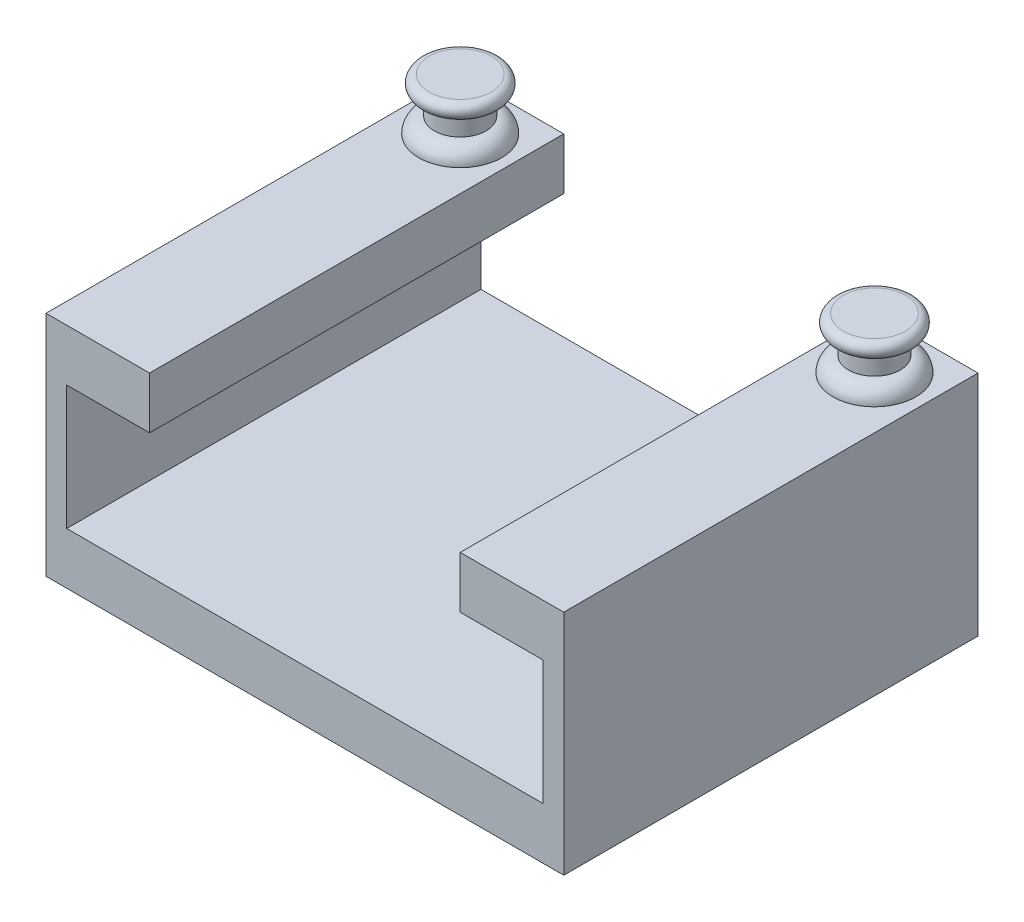
ISO-10303-21;
HEADER;
FILE_DESCRIPTION(('STEP AP214'),'2;1');
FILE_NAME('part.step','',(''),(''),'','','');
FILE_SCHEMA(('AUTOMOTIVE_DESIGN { 1 0 10303 214 1 1 1 1 }'));
ENDSEC;
DATA;
#1=APPLICATION_CONTEXT('core data for automotive mechanical design processes');
#2=APPLICATION_PROTOCOL_DEFINITION('international standard','automotive_design',2000,#1);
#3=PRODUCT_CONTEXT('',#1,'mechanical');
#4=PRODUCT('Part','Part','',(#3));
#5=PRODUCT_RELATED_PRODUCT_CATEGORY('part','',(#4));
#6=PRODUCT_DEFINITION_FORMATION('','',#4);
#7=PRODUCT_DEFINITION_CONTEXT('part definition',#1,'design');
#8=PRODUCT_DEFINITION('design','',#6,#7);
#9=PRODUCT_DEFINITION_SHAPE('','',#8);
#10=(LENGTH_UNIT() NAMED_UNIT(*) SI_UNIT(.MILLI.,.METRE.));
#11=(NAMED_UNIT(*) PLANE_ANGLE_UNIT() SI_UNIT($,.RADIAN.));
#12=(NAMED_UNIT(*) SI_UNIT($,.STERADIAN.) SOLID_ANGLE_UNIT());
#13=UNCERTAINTY_MEASURE_WITH_UNIT(LENGTH_MEASURE(1.E-05),#10,'distance_accuracy_value','');
#14=(GEOMETRIC_REPRESENTATION_CONTEXT(3) GLOBAL_UNCERTAINTY_ASSIGNED_CONTEXT((#13)) GLOBAL_UNIT_ASSIGNED_CONTEXT((#10,
#11,#12)) REPRESENTATION_CONTEXT('',''));
#15=CARTESIAN_POINT('',(0.,0.,0.));
#16=DIRECTION('',(0.,0.,1.));
#17=DIRECTION('',(1.,0.,0.));
#18=AXIS2_PLACEMENT_3D('',#15,#16,#17);
#19=CARTESIAN_POINT('',(0.,22.,0.));
#20=DIRECTION('',(0.,-1.,0.));
#21=DIRECTION('',(0.,0.,-1.));
#22=AXIS2_PLACEMENT_3D('',#19,#20,#21);
#23=PLANE('',#22);
#24=DIRECTION('',(0.,0.,-1.));
#25=VECTOR('',#24,1.);
#26=CARTESIAN_POINT('',(50.,22.,-40.));
#27=LINE('',#26,#25);
#28=CARTESIAN_POINT('',(50.,22.,0.));
#29=VERTEX_POINT('',#28);
#30=CARTESIAN_POINT('',(50.,22.,-40.));
#31=VERTEX_POINT('',#30);
#32=EDGE_CURVE('E127',#29,#31,#27,.T.);
#33=ORIENTED_EDGE('',*,*,#32,.T.);
#34=DIRECTION('',(-1.,0.,0.));
#35=VECTOR('',#34,1.);
#36=CARTESIAN_POINT('',(50.,22.,-40.));
#37=LINE('',#36,#35);
#38=CARTESIAN_POINT('',(40.,22.,-40.));
#39=VERTEX_POINT('',#38);
#40=EDGE_CURVE('E135',#31,#39,#37,.T.);
#41=ORIENTED_EDGE('',*,*,#40,.T.);
#42=DIRECTION('',(0.,0.,1.));
#43=VECTOR('',#42,1.);
#44=CARTESIAN_POINT('',(40.,22.,-40.));
#45=LINE('',#44,#43);
#46=CARTESIAN_POINT('',(40.,22.,0.));
#47=VERTEX_POINT('',#46);
#48=EDGE_CURVE('E141',#39,#47,#45,.T.);
#49=ORIENTED_EDGE('',*,*,#48,.T.);
#50=DIRECTION('',(1.,0.,0.));
#51=VECTOR('',#50,1.);
#52=CARTESIAN_POINT('',(50.,22.,0.));
#53=LINE('',#52,#51);
#54=EDGE_CURVE('E146',#47,#29,#53,.T.);
#55=ORIENTED_EDGE('',*,*,#54,.T.);
#56=EDGE_LOOP('',(#33,#41,#49,#55));
#57=FACE_BOUND('',#56,.T.);
#58=CARTESIAN_POINT('',(45.,22.,-35.));
#59=DIRECTION('',(0.,-1.,0.));
#60=DIRECTION('',(0.,0.,-1.));
#61=AXIS2_PLACEMENT_3D('',#58,#59,#60);
#62=CIRCLE('',#61,4.);
#63=CARTESIAN_POINT('',(45.,22.,-39.));
#64=VERTEX_POINT('',#63);
#65=EDGE_CURVE('E11',#64,#64,#62,.F.);
#66=ORIENTED_EDGE('',*,*,#65,.F.);
#67=EDGE_LOOP('',(#66));
#68=FACE_BOUND('',#67,.T.);
#69=ADVANCED_FACE('F35',(#57,#68),#23,.F.);
#70=CARTESIAN_POINT('',(0.,22.,0.));
#71=DIRECTION('',(0.,1.,0.));
#72=DIRECTION('',(0.,0.,1.));
#73=AXIS2_PLACEMENT_3D('',#70,#71,#72);
#74=PLANE('',#73);
#75=DIRECTION('',(0.,0.,1.));
#76=VECTOR('',#75,1.);
#77=CARTESIAN_POINT('',(0.,22.,-40.));
#78=LINE('',#77,#76);
#79=CARTESIAN_POINT('',(0.,22.,-40.));
#80=VERTEX_POINT('',#79);
#81=CARTESIAN_POINT('',(0.,22.,0.));
#82=VERTEX_POINT('',#81);
#83=EDGE_CURVE('E166',#80,#82,#78,.T.);
#84=ORIENTED_EDGE('',*,*,#83,.T.);
#85=DIRECTION('',(1.,0.,0.));
#86=VECTOR('',#85,1.);
#87=CARTESIAN_POINT('',(0.,22.,0.));
#88=LINE('',#87,#86);
#89=CARTESIAN_POINT('',(10.,22.,0.));
#90=VERTEX_POINT('',#89);
#91=EDGE_CURVE('E169',#82,#90,#88,.T.);
#92=ORIENTED_EDGE('',*,*,#91,.T.);
#93=DIRECTION('',(0.,0.,-1.));
#94=VECTOR('',#93,1.);
#95=CARTESIAN_POINT('',(10.,22.,-40.));
#96=LINE('',#95,#94);
#97=CARTESIAN_POINT('',(10.,22.,-40.));
#98=VERTEX_POINT('',#97);
#99=EDGE_CURVE('E172',#90,#98,#96,.T.);
#100=ORIENTED_EDGE('',*,*,#99,.T.);
#101=DIRECTION('',(-1.,0.,0.));
#102=VECTOR('',#101,1.);
#103=CARTESIAN_POINT('',(0.,22.,-40.));
#104=LINE('',#103,#102);
#105=EDGE_CURVE('E174',#98,#80,#104,.T.);
#106=ORIENTED_EDGE('',*,*,#105,.T.);
#107=EDGE_LOOP('',(#84,#92,#100,#106));
#108=FACE_BOUND('',#107,.T.);
#109=CARTESIAN_POINT('',(5.,22.,-35.));
#110=DIRECTION('',(0.,-1.,0.));
#111=DIRECTION('',(1.,0.,0.));
#112=AXIS2_PLACEMENT_3D('',#109,#110,#111);
#113=CIRCLE('',#112,4.);
#114=CARTESIAN_POINT('',(9.,22.,-35.));
#115=VERTEX_POINT('',#114);
#116=EDGE_CURVE('E523',#115,#115,#113,.T.);
#117=ORIENTED_EDGE('',*,*,#116,.T.);
#118=EDGE_LOOP('',(#117));
#119=FACE_BOUND('',#118,.T.);
#120=ADVANCED_FACE('F255',(#108,#119),#74,.T.);
#121=CARTESIAN_POINT('',(0.,5.,0.));
#122=DIRECTION('',(0.,1.,0.));
#123=DIRECTION('',(0.,0.,1.));
#124=AXIS2_PLACEMENT_3D('',#121,#122,#123);
#125=PLANE('',#124);
#126=DIRECTION('',(1.,0.,0.));
#127=VECTOR('',#126,1.);
#128=CARTESIAN_POINT('',(0.,5.,0.));
#129=LINE('',#128,#127);
#130=CARTESIAN_POINT('',(2.,5.,0.));
#131=VERTEX_POINT('',#130);
#132=CARTESIAN_POINT('',(48.,5.,0.));
#133=VERTEX_POINT('',#132);
#134=EDGE_CURVE('E55',#131,#133,#129,.T.);
#135=ORIENTED_EDGE('',*,*,#134,.T.);
#136=DIRECTION('',(0.,0.,1.));
#137=VECTOR('',#136,1.);
#138=CARTESIAN_POINT('',(48.,5.,-40.));
#139=LINE('',#138,#137);
#140=CARTESIAN_POINT('',(48.,5.,-40.));
#141=VERTEX_POINT('',#140);
#142=EDGE_CURVE('E50',#141,#133,#139,.T.);
#143=ORIENTED_EDGE('',*,*,#142,.F.);
#144=DIRECTION('',(1.,0.,0.));
#145=VECTOR('',#144,1.);
#146=CARTESIAN_POINT('',(0.,5.,-40.));
#147=LINE('',#146,#145);
#148=CARTESIAN_POINT('',(2.,5.,-40.));
#149=VERTEX_POINT('',#148);
#150=EDGE_CURVE('E211',#149,#141,#147,.T.);
#151=ORIENTED_EDGE('',*,*,#150,.F.);
#152=DIRECTION('',(0.,0.,-1.));
#153=VECTOR('',#152,1.);
#154=CARTESIAN_POINT('',(2.,5.,-40.));
#155=LINE('',#154,#153);
#156=EDGE_CURVE('E198',#131,#149,#155,.T.);
#157=ORIENTED_EDGE('',*,*,#156,.F.);
#158=EDGE_LOOP('',(#135,#143,#151,#157));
#159=FACE_BOUND('',#158,.T.);
#160=ADVANCED_FACE('F250',(#159),#125,.T.);
#161=CARTESIAN_POINT('',(0.,5.,0.));
#162=DIRECTION('',(0.,0.,-1.));
#163=DIRECTION('',(-1.,0.,0.));
#164=AXIS2_PLACEMENT_3D('',#161,#162,#163);
#165=PLANE('',#164);
#166=DIRECTION('',(1.,0.,0.));
#167=VECTOR('',#166,1.);
#168=CARTESIAN_POINT('',(0.,0.,0.));
#169=LINE('',#168,#167);
#170=CARTESIAN_POINT('',(0.,0.,0.));
#171=VERTEX_POINT('',#170);
#172=CARTESIAN_POINT('',(50.,0.,0.));
#173=VERTEX_POINT('',#172);
#174=EDGE_CURVE('E219',#171,#173,#169,.T.);
#175=ORIENTED_EDGE('',*,*,#174,.T.);
#176=DIRECTION('',(0.,-1.,0.));
#177=VECTOR('',#176,1.);
#178=CARTESIAN_POINT('',(50.,5.,0.));
#179=LINE('',#178,#177);
#180=EDGE_CURVE('E43',#29,#173,#179,.T.);
#181=ORIENTED_EDGE('',*,*,#180,.F.);
#182=ORIENTED_EDGE('',*,*,#54,.F.);
#183=DIRECTION('',(0.,-1.,0.));
#184=VECTOR('',#183,1.);
#185=CARTESIAN_POINT('',(40.,22.,0.));
#186=LINE('',#185,#184);
#187=CARTESIAN_POINT('',(40.,17.,0.));
#188=VERTEX_POINT('',#187);
#189=EDGE_CURVE('E158',#47,#188,#186,.T.);
#190=ORIENTED_EDGE('',*,*,#189,.T.);
#191=DIRECTION('',(1.,0.,0.));
#192=VECTOR('',#191,1.);
#193=CARTESIAN_POINT('',(50.,17.,0.));
#194=LINE('',#193,#192);
#195=CARTESIAN_POINT('',(48.,17.,0.));
#196=VERTEX_POINT('',#195);
#197=EDGE_CURVE('E147',#188,#196,#194,.T.);
#198=ORIENTED_EDGE('',*,*,#197,.T.);
#199=DIRECTION('',(0.,-1.,0.));
#200=VECTOR('',#199,1.);
#201=CARTESIAN_POINT('',(48.,17.,0.));
#202=LINE('',#201,#200);
#203=EDGE_CURVE('E191',#196,#133,#202,.T.);
#204=ORIENTED_EDGE('',*,*,#203,.T.);
#205=ORIENTED_EDGE('',*,*,#134,.F.);
#206=DIRECTION('',(0.,-1.,0.));
#207=VECTOR('',#206,1.);
#208=CARTESIAN_POINT('',(2.,17.,0.));
#209=LINE('',#208,#207);
#210=CARTESIAN_POINT('',(2.,17.,0.));
#211=VERTEX_POINT('',#210);
#212=EDGE_CURVE('E215',#211,#131,#209,.T.);
#213=ORIENTED_EDGE('',*,*,#212,.F.);
#214=DIRECTION('',(1.,0.,0.));
#215=VECTOR('',#214,1.);
#216=CARTESIAN_POINT('',(0.,17.,0.));
#217=LINE('',#216,#215);
#218=CARTESIAN_POINT('',(10.,17.,0.));
#219=VERTEX_POINT('',#218);
#220=EDGE_CURVE('E165',#211,#219,#217,.T.);
#221=ORIENTED_EDGE('',*,*,#220,.T.);
#222=DIRECTION('',(0.,-1.,0.));
#223=VECTOR('',#222,1.);
#224=CARTESIAN_POINT('',(10.,22.,0.));
#225=LINE('',#224,#223);
#226=EDGE_CURVE('E185',#90,#219,#225,.T.);
#227=ORIENTED_EDGE('',*,*,#226,.F.);
#228=ORIENTED_EDGE('',*,*,#91,.F.);
#229=DIRECTION('',(0.,-1.,0.));
#230=VECTOR('',#229,1.);
#231=CARTESIAN_POINT('',(0.,5.,0.));
#232=LINE('',#231,#230);
#233=EDGE_CURVE('E235',#82,#171,#232,.T.);
#234=ORIENTED_EDGE('',*,*,#233,.T.);
#235=EDGE_LOOP('',(#175,#181,#182,#190,#198,#204,#205,#213,#221,#227,#228,#234));
#236=FACE_BOUND('',#235,.T.);
#237=ADVANCED_FACE('F37',(#236),#165,.F.);
#238=CARTESIAN_POINT('',(50.,5.,0.));
#239=DIRECTION('',(-1.,0.,0.));
#240=DIRECTION('',(0.,0.,1.));
#241=AXIS2_PLACEMENT_3D('',#238,#239,#240);
#242=PLANE('',#241);
#243=DIRECTION('',(0.,0.,-1.));
#244=VECTOR('',#243,1.);
#245=CARTESIAN_POINT('',(50.,0.,0.));
#246=LINE('',#245,#244);
#247=CARTESIAN_POINT('',(50.,0.,-40.));
#248=VERTEX_POINT('',#247);
#249=EDGE_CURVE('E128',#173,#248,#246,.T.);
#250=ORIENTED_EDGE('',*,*,#249,.T.);
#251=DIRECTION('',(0.,-1.,0.));
#252=VECTOR('',#251,1.);
#253=CARTESIAN_POINT('',(50.,5.,-40.));
#254=LINE('',#253,#252);
#255=EDGE_CURVE('E122',#31,#248,#254,.T.);
#256=ORIENTED_EDGE('',*,*,#255,.F.);
#257=ORIENTED_EDGE('',*,*,#32,.F.);
#258=ORIENTED_EDGE('',*,*,#180,.T.);
#259=EDGE_LOOP('',(#250,#256,#257,#258));
#260=FACE_BOUND('',#259,.T.);
#261=ADVANCED_FACE('F124',(#260),#242,.F.);
#262=CARTESIAN_POINT('',(0.,5.,-40.));
#263=DIRECTION('',(0.,0.,-1.));
#264=DIRECTION('',(-1.,0.,0.));
#265=AXIS2_PLACEMENT_3D('',#262,#263,#264);
#266=PLANE('',#265);
#267=DIRECTION('',(1.,0.,0.));
#268=VECTOR('',#267,1.);
#269=CARTESIAN_POINT('',(0.,0.,-40.));
#270=LINE('',#269,#268);
#271=CARTESIAN_POINT('',(0.,0.,-40.));
#272=VERTEX_POINT('',#271);
#273=EDGE_CURVE('E227',#272,#248,#270,.T.);
#274=ORIENTED_EDGE('',*,*,#273,.F.);
#275=DIRECTION('',(0.,-1.,0.));
#276=VECTOR('',#275,1.);
#277=CARTESIAN_POINT('',(0.,5.,-40.));
#278=LINE('',#277,#276);
#279=EDGE_CURVE('E132',#80,#272,#278,.T.);
#280=ORIENTED_EDGE('',*,*,#279,.F.);
#281=ORIENTED_EDGE('',*,*,#105,.F.);
#282=DIRECTION('',(0.,-1.,0.));
#283=VECTOR('',#282,1.);
#284=CARTESIAN_POINT('',(10.,22.,-40.));
#285=LINE('',#284,#283);
#286=CARTESIAN_POINT('',(10.,17.,-40.));
#287=VERTEX_POINT('',#286);
#288=EDGE_CURVE('E177',#98,#287,#285,.T.);
#289=ORIENTED_EDGE('',*,*,#288,.T.);
#290=DIRECTION('',(-1.,0.,0.));
#291=VECTOR('',#290,1.);
#292=CARTESIAN_POINT('',(0.,17.,-40.));
#293=LINE('',#292,#291);
#294=CARTESIAN_POINT('',(2.,17.,-40.));
#295=VERTEX_POINT('',#294);
#296=EDGE_CURVE('E170',#287,#295,#293,.T.);
#297=ORIENTED_EDGE('',*,*,#296,.T.);
#298=DIRECTION('',(0.,-1.,0.));
#299=VECTOR('',#298,1.);
#300=CARTESIAN_POINT('',(2.,17.,-40.));
#301=LINE('',#300,#299);
#302=EDGE_CURVE('E202',#295,#149,#301,.T.);
#303=ORIENTED_EDGE('',*,*,#302,.T.);
#304=ORIENTED_EDGE('',*,*,#150,.T.);
#305=DIRECTION('',(0.,-1.,0.));
#306=VECTOR('',#305,1.);
#307=CARTESIAN_POINT('',(48.,17.,-40.));
#308=LINE('',#307,#306);
#309=CARTESIAN_POINT('',(48.,17.,-40.));
#310=VERTEX_POINT('',#309);
#311=EDGE_CURVE('E195',#310,#141,#308,.T.);
#312=ORIENTED_EDGE('',*,*,#311,.F.);
#313=DIRECTION('',(-1.,0.,0.));
#314=VECTOR('',#313,1.);
#315=CARTESIAN_POINT('',(50.,17.,-40.));
#316=LINE('',#315,#314);
#317=CARTESIAN_POINT('',(40.,17.,-40.));
#318=VERTEX_POINT('',#317);
#319=EDGE_CURVE('E159',#310,#318,#316,.T.);
#320=ORIENTED_EDGE('',*,*,#319,.T.);
#321=DIRECTION('',(0.,-1.,0.));
#322=VECTOR('',#321,1.);
#323=CARTESIAN_POINT('',(40.,22.,-40.));
#324=LINE('',#323,#322);
#325=EDGE_CURVE('E138',#39,#318,#324,.T.);
#326=ORIENTED_EDGE('',*,*,#325,.F.);
#327=ORIENTED_EDGE('',*,*,#40,.F.);
#328=ORIENTED_EDGE('',*,*,#255,.T.);
#329=EDGE_LOOP('',(#274,#280,#281,#289,#297,#303,#304,#312,#320,#326,#327,#328));
#330=FACE_BOUND('',#329,.T.);
#331=ADVANCED_FACE('F136',(#330),#266,.T.);
#332=CARTESIAN_POINT('',(0.,5.,0.));
#333=DIRECTION('',(-1.,0.,0.));
#334=DIRECTION('',(0.,0.,1.));
#335=AXIS2_PLACEMENT_3D('',#332,#333,#334);
#336=PLANE('',#335);
#337=DIRECTION('',(0.,0.,-1.));
#338=VECTOR('',#337,1.);
#339=CARTESIAN_POINT('',(0.,0.,0.));
#340=LINE('',#339,#338);
#341=EDGE_CURVE('E232',#171,#272,#340,.T.);
#342=ORIENTED_EDGE('',*,*,#341,.F.);
#343=ORIENTED_EDGE('',*,*,#233,.F.);
#344=ORIENTED_EDGE('',*,*,#83,.F.);
#345=ORIENTED_EDGE('',*,*,#279,.T.);
#346=EDGE_LOOP('',(#342,#343,#344,#345));
#347=FACE_BOUND('',#346,.T.);
#348=ADVANCED_FACE('F288',(#347),#336,.T.);
#349=CARTESIAN_POINT('',(0.,0.,0.));
#350=DIRECTION('',(0.,1.,0.));
#351=DIRECTION('',(0.,0.,1.));
#352=AXIS2_PLACEMENT_3D('',#349,#350,#351);
#353=PLANE('',#352);
#354=ORIENTED_EDGE('',*,*,#174,.F.);
#355=ORIENTED_EDGE('',*,*,#341,.T.);
#356=ORIENTED_EDGE('',*,*,#273,.T.);
#357=ORIENTED_EDGE('',*,*,#249,.F.);
#358=EDGE_LOOP('',(#354,#355,#356,#357));
#359=FACE_BOUND('',#358,.T.);
#360=ADVANCED_FACE('F284',(#359),#353,.F.);
#361=CARTESIAN_POINT('',(2.,17.,-40.));
#362=DIRECTION('',(-1.,0.,0.));
#363=DIRECTION('',(0.,0.,1.));
#364=AXIS2_PLACEMENT_3D('',#361,#362,#363);
#365=PLANE('',#364);
#366=ORIENTED_EDGE('',*,*,#156,.T.);
#367=ORIENTED_EDGE('',*,*,#302,.F.);
#368=DIRECTION('',(0.,0.,-1.));
#369=VECTOR('',#368,1.);
#370=CARTESIAN_POINT('',(2.,17.,-40.));
#371=LINE('',#370,#369);
#372=EDGE_CURVE('E199',#211,#295,#371,.T.);
#373=ORIENTED_EDGE('',*,*,#372,.F.);
#374=ORIENTED_EDGE('',*,*,#212,.T.);
#375=EDGE_LOOP('',(#366,#367,#373,#374));
#376=FACE_BOUND('',#375,.T.);
#377=ADVANCED_FACE('F282',(#376),#365,.F.);
#378=CARTESIAN_POINT('',(48.,17.,-40.));
#379=DIRECTION('',(1.,0.,0.));
#380=DIRECTION('',(0.,0.,-1.));
#381=AXIS2_PLACEMENT_3D('',#378,#379,#380);
#382=PLANE('',#381);
#383=ORIENTED_EDGE('',*,*,#142,.T.);
#384=ORIENTED_EDGE('',*,*,#203,.F.);
#385=DIRECTION('',(0.,0.,1.));
#386=VECTOR('',#385,1.);
#387=CARTESIAN_POINT('',(48.,17.,-40.));
#388=LINE('',#387,#386);
#389=EDGE_CURVE('E188',#310,#196,#388,.T.);
#390=ORIENTED_EDGE('',*,*,#389,.F.);
#391=ORIENTED_EDGE('',*,*,#311,.T.);
#392=EDGE_LOOP('',(#383,#384,#390,#391));
#393=FACE_BOUND('',#392,.T.);
#394=ADVANCED_FACE('F240',(#393),#382,.F.);
#395=CARTESIAN_POINT('',(0.,17.,0.));
#396=DIRECTION('',(0.,1.,0.));
#397=DIRECTION('',(0.,0.,1.));
#398=AXIS2_PLACEMENT_3D('',#395,#396,#397);
#399=PLANE('',#398);
#400=ORIENTED_EDGE('',*,*,#220,.F.);
#401=ORIENTED_EDGE('',*,*,#372,.T.);
#402=ORIENTED_EDGE('',*,*,#296,.F.);
#403=DIRECTION('',(0.,0.,-1.));
#404=VECTOR('',#403,1.);
#405=CARTESIAN_POINT('',(10.,17.,-40.));
#406=LINE('',#405,#404);
#407=EDGE_CURVE('E179',#219,#287,#406,.T.);
#408=ORIENTED_EDGE('',*,*,#407,.F.);
#409=EDGE_LOOP('',(#400,#401,#402,#408));
#410=FACE_BOUND('',#409,.T.);
#411=ADVANCED_FACE('F273',(#410),#399,.F.);
#412=CARTESIAN_POINT('',(10.,22.,-40.));
#413=DIRECTION('',(-1.,0.,0.));
#414=DIRECTION('',(0.,0.,1.));
#415=AXIS2_PLACEMENT_3D('',#412,#413,#414);
#416=PLANE('',#415);
#417=ORIENTED_EDGE('',*,*,#407,.T.);
#418=ORIENTED_EDGE('',*,*,#288,.F.);
#419=ORIENTED_EDGE('',*,*,#99,.F.);
#420=ORIENTED_EDGE('',*,*,#226,.T.);
#421=EDGE_LOOP('',(#417,#418,#419,#420));
#422=FACE_BOUND('',#421,.T.);
#423=ADVANCED_FACE('F270',(#422),#416,.F.);
#424=CARTESIAN_POINT('',(0.,17.,0.));
#425=DIRECTION('',(0.,-1.,0.));
#426=DIRECTION('',(0.,0.,-1.));
#427=AXIS2_PLACEMENT_3D('',#424,#425,#426);
#428=PLANE('',#427);
#429=ORIENTED_EDGE('',*,*,#389,.T.);
#430=ORIENTED_EDGE('',*,*,#197,.F.);
#431=DIRECTION('',(0.,0.,1.));
#432=VECTOR('',#431,1.);
#433=CARTESIAN_POINT('',(40.,17.,-40.));
#434=LINE('',#433,#432);
#435=EDGE_CURVE('E150',#318,#188,#434,.T.);
#436=ORIENTED_EDGE('',*,*,#435,.F.);
#437=ORIENTED_EDGE('',*,*,#319,.F.);
#438=EDGE_LOOP('',(#429,#430,#436,#437));
#439=FACE_BOUND('',#438,.T.);
#440=ADVANCED_FACE('F245',(#439),#428,.T.);
#441=CARTESIAN_POINT('',(40.,22.,-40.));
#442=DIRECTION('',(1.,0.,0.));
#443=DIRECTION('',(0.,0.,-1.));
#444=AXIS2_PLACEMENT_3D('',#441,#442,#443);
#445=PLANE('',#444);
#446=ORIENTED_EDGE('',*,*,#435,.T.);
#447=ORIENTED_EDGE('',*,*,#189,.F.);
#448=ORIENTED_EDGE('',*,*,#48,.F.);
#449=ORIENTED_EDGE('',*,*,#325,.T.);
#450=EDGE_LOOP('',(#446,#447,#448,#449));
#451=FACE_BOUND('',#450,.T.);
#452=ADVANCED_FACE('F247',(#451),#445,.F.);
#453=CARTESIAN_POINT('',(0.,27.,-35.));
#454=DIRECTION('',(0.,-1.,0.));
#455=DIRECTION('',(1.,0.,0.));
#456=AXIS2_PLACEMENT_3D('',#453,#454,#455);
#457=PLANE('',#456);
#458=CARTESIAN_POINT('',(5.,27.,-35.));
#459=DIRECTION('',(0.,-1.,0.));
#460=DIRECTION('',(1.,0.,0.));
#461=AXIS2_PLACEMENT_3D('',#458,#459,#460);
#462=CIRCLE('',#461,3.);
#463=CARTESIAN_POINT('',(8.,27.,-35.));
#464=VERTEX_POINT('',#463);
#465=EDGE_CURVE('E153',#464,#464,#462,.T.);
#466=ORIENTED_EDGE('',*,*,#465,.F.);
#467=EDGE_LOOP('',(#466));
#468=FACE_BOUND('',#467,.T.);
#469=ADVANCED_FACE('F266',(#468),#457,.F.);
#470=CARTESIAN_POINT('',(5.,26.25,-35.));
#471=DIRECTION('',(0.,-1.,0.));
#472=DIRECTION('',(1.,0.,0.));
#473=AXIS2_PLACEMENT_3D('',#470,#471,#472);
#474=TOROIDAL_SURFACE('',#473,3.,0.750000000000001);
#475=CARTESIAN_POINT('',(5.,25.5,-35.));
#476=DIRECTION('',(0.,-1.,0.));
#477=DIRECTION('',(1.,0.,0.));
#478=AXIS2_PLACEMENT_3D('',#475,#476,#477);
#479=CIRCLE('',#478,3.);
#480=CARTESIAN_POINT('',(8.,25.5,-35.));
#481=VERTEX_POINT('',#480);
#482=EDGE_CURVE('E531',#481,#481,#479,.T.);
#483=ORIENTED_EDGE('',*,*,#482,.F.);
#484=EDGE_LOOP('',(#483));
#485=FACE_BOUND('',#484,.T.);
#486=ORIENTED_EDGE('',*,*,#465,.T.);
#487=EDGE_LOOP('',(#486));
#488=FACE_BOUND('',#487,.T.);
#489=ADVANCED_FACE('F338',(#485,#488),#474,.T.);
#490=CARTESIAN_POINT('',(0.,25.5,-35.));
#491=DIRECTION('',(0.,-1.,0.));
#492=DIRECTION('',(1.,0.,0.));
#493=AXIS2_PLACEMENT_3D('',#490,#491,#492);
#494=PLANE('',#493);
#495=ORIENTED_EDGE('',*,*,#482,.T.);
#496=EDGE_LOOP('',(#495));
#497=FACE_BOUND('',#496,.T.);
#498=CARTESIAN_POINT('',(5.,25.5,-35.));
#499=DIRECTION('',(0.,-1.,0.));
#500=DIRECTION('',(1.,0.,0.));
#501=AXIS2_PLACEMENT_3D('',#498,#499,#500);
#502=CIRCLE('',#501,2.5);
#503=CARTESIAN_POINT('',(7.5,25.5,-35.));
#504=VERTEX_POINT('',#503);
#505=EDGE_CURVE('E529',#504,#504,#502,.T.);
#506=ORIENTED_EDGE('',*,*,#505,.F.);
#507=EDGE_LOOP('',(#506));
#508=FACE_BOUND('',#507,.T.);
#509=ADVANCED_FACE('F345',(#497,#508),#494,.T.);
#510=CARTESIAN_POINT('',(5.,22.,-35.));
#511=DIRECTION('',(0.,-1.,0.));
#512=DIRECTION('',(1.,0.,0.));
#513=AXIS2_PLACEMENT_3D('',#510,#511,#512);
#514=CYLINDRICAL_SURFACE('',#513,2.5);
#515=CARTESIAN_POINT('',(5.,23.5,-35.));
#516=DIRECTION('',(0.,-1.,0.));
#517=DIRECTION('',(1.,0.,0.));
#518=AXIS2_PLACEMENT_3D('',#515,#516,#517);
#519=CIRCLE('',#518,2.5);
#520=CARTESIAN_POINT('',(7.5,23.5,-35.));
#521=VERTEX_POINT('',#520);
#522=EDGE_CURVE('E526',#521,#521,#519,.T.);
#523=ORIENTED_EDGE('',*,*,#522,.F.);
#524=EDGE_LOOP('',(#523));
#525=FACE_BOUND('',#524,.T.);
#526=ORIENTED_EDGE('',*,*,#505,.T.);
#527=EDGE_LOOP('',(#526));
#528=FACE_BOUND('',#527,.T.);
#529=ADVANCED_FACE('F352',(#525,#528),#514,.T.);
#530=CARTESIAN_POINT('',(5.,22.,-35.));
#531=DIRECTION('',(0.,-1.,0.));
#532=DIRECTION('',(1.,0.,0.));
#533=AXIS2_PLACEMENT_3D('',#530,#531,#532);
#534=TOROIDAL_SURFACE('',#533,2.5,1.5);
#535=ORIENTED_EDGE('',*,*,#116,.F.);
#536=EDGE_LOOP('',(#535));
#537=FACE_BOUND('',#536,.T.);
#538=ORIENTED_EDGE('',*,*,#522,.T.);
#539=EDGE_LOOP('',(#538));
#540=FACE_BOUND('',#539,.T.);
#541=ADVANCED_FACE('F360',(#537,#540),#534,.T.);
#542=CARTESIAN_POINT('',(50.,27.,-35.));
#543=DIRECTION('',(0.,-1.,0.));
#544=DIRECTION('',(-1.,0.,0.));
#545=AXIS2_PLACEMENT_3D('',#542,#543,#544);
#546=PLANE('',#545);
#547=CARTESIAN_POINT('',(45.,27.,-35.));
#548=DIRECTION('',(0.,1.,0.));
#549=DIRECTION('',(-1.,0.,0.));
#550=AXIS2_PLACEMENT_3D('',#547,#548,#549);
#551=CIRCLE('',#550,3.);
#552=CARTESIAN_POINT('',(42.,27.,-35.));
#553=VERTEX_POINT('',#552);
#554=EDGE_CURVE('E520',#553,#553,#551,.T.);
#555=ORIENTED_EDGE('',*,*,#554,.T.);
#556=EDGE_LOOP('',(#555));
#557=FACE_BOUND('',#556,.T.);
#558=ADVANCED_FACE('F368',(#557),#546,.F.);
#559=CARTESIAN_POINT('',(45.,26.25,-35.));
#560=DIRECTION('',(0.,-1.,0.));
#561=DIRECTION('',(-1.,0.,0.));
#562=AXIS2_PLACEMENT_3D('',#559,#560,#561);
#563=TOROIDAL_SURFACE('',#562,3.,0.750000000000001);
#564=CARTESIAN_POINT('',(45.,25.5,-35.));
#565=DIRECTION('',(0.,1.,0.));
#566=DIRECTION('',(-1.,0.,0.));
#567=AXIS2_PLACEMENT_3D('',#564,#565,#566);
#568=CIRCLE('',#567,3.);
#569=CARTESIAN_POINT('',(42.,25.5,-35.));
#570=VERTEX_POINT('',#569);
#571=EDGE_CURVE('E515',#570,#570,#568,.T.);
#572=ORIENTED_EDGE('',*,*,#571,.T.);
#573=EDGE_LOOP('',(#572));
#574=FACE_BOUND('',#573,.T.);
#575=ORIENTED_EDGE('',*,*,#554,.F.);
#576=EDGE_LOOP('',(#575));
#577=FACE_BOUND('',#576,.T.);
#578=ADVANCED_FACE('F376',(#574,#577),#563,.T.);
#579=CARTESIAN_POINT('',(50.,25.5,-35.));
#580=DIRECTION('',(0.,-1.,0.));
#581=DIRECTION('',(-1.,0.,0.));
#582=AXIS2_PLACEMENT_3D('',#579,#580,#581);
#583=PLANE('',#582);
#584=ORIENTED_EDGE('',*,*,#571,.F.);
#585=EDGE_LOOP('',(#584));
#586=FACE_BOUND('',#585,.T.);
#587=CARTESIAN_POINT('',(45.,25.5,-35.));
#588=DIRECTION('',(0.,1.,0.));
#589=DIRECTION('',(-1.,0.,0.));
#590=AXIS2_PLACEMENT_3D('',#587,#588,#589);
#591=CIRCLE('',#590,2.5);
#592=CARTESIAN_POINT('',(42.5,25.5,-35.));
#593=VERTEX_POINT('',#592);
#594=EDGE_CURVE('E512',#593,#593,#591,.T.);
#595=ORIENTED_EDGE('',*,*,#594,.T.);
#596=EDGE_LOOP('',(#595));
#597=FACE_BOUND('',#596,.T.);
#598=ADVANCED_FACE('F384',(#586,#597),#583,.T.);
#599=CARTESIAN_POINT('',(45.,22.,-35.));
#600=DIRECTION('',(0.,-1.,0.));
#601=DIRECTION('',(-1.,0.,0.));
#602=AXIS2_PLACEMENT_3D('',#599,#600,#601);
#603=CYLINDRICAL_SURFACE('',#602,2.5);
#604=CARTESIAN_POINT('',(45.,23.5,-35.));
#605=DIRECTION('',(0.,1.,0.));
#606=DIRECTION('',(-1.,0.,0.));
#607=AXIS2_PLACEMENT_3D('',#604,#605,#606);
#608=CIRCLE('',#607,2.5);
#609=CARTESIAN_POINT('',(42.5,23.5,-35.));
#610=VERTEX_POINT('',#609);
#611=EDGE_CURVE('E511',#610,#610,#608,.T.);
#612=ORIENTED_EDGE('',*,*,#611,.T.);
#613=EDGE_LOOP('',(#612));
#614=FACE_BOUND('',#613,.T.);
#615=ORIENTED_EDGE('',*,*,#594,.F.);
#616=EDGE_LOOP('',(#615));
#617=FACE_BOUND('',#616,.T.);
#618=ADVANCED_FACE('F392',(#614,#617),#603,.T.);
#619=CARTESIAN_POINT('',(45.,22.,-35.));
#620=DIRECTION('',(0.,-1.,0.));
#621=DIRECTION('',(-1.,0.,0.));
#622=AXIS2_PLACEMENT_3D('',#619,#620,#621);
#623=TOROIDAL_SURFACE('',#622,2.5,1.5);
#624=ORIENTED_EDGE('',*,*,#65,.T.);
#625=EDGE_LOOP('',(#624));
#626=FACE_BOUND('',#625,.T.);
#627=ORIENTED_EDGE('',*,*,#611,.F.);
#628=EDGE_LOOP('',(#627));
#629=FACE_BOUND('',#628,.T.);
#630=ADVANCED_FACE('F400',(#626,#629),#623,.T.);
#631=CLOSED_SHELL('',(#69,#120,#160,#237,#261,#331,#348,#360,#377,#394,#411,#423,#440,#452,#469,
#489,#509,#529,#541,#558,#578,#598,#618,#630));
#632=MANIFOLD_SOLID_BREP('B2',#631);
#633=ADVANCED_BREP_SHAPE_REPRESENTATION('',(#18,#632),#14);
#634=SHAPE_DEFINITION_REPRESENTATION(#9,#633);
ENDSEC;
END-ISO-10303-21;
